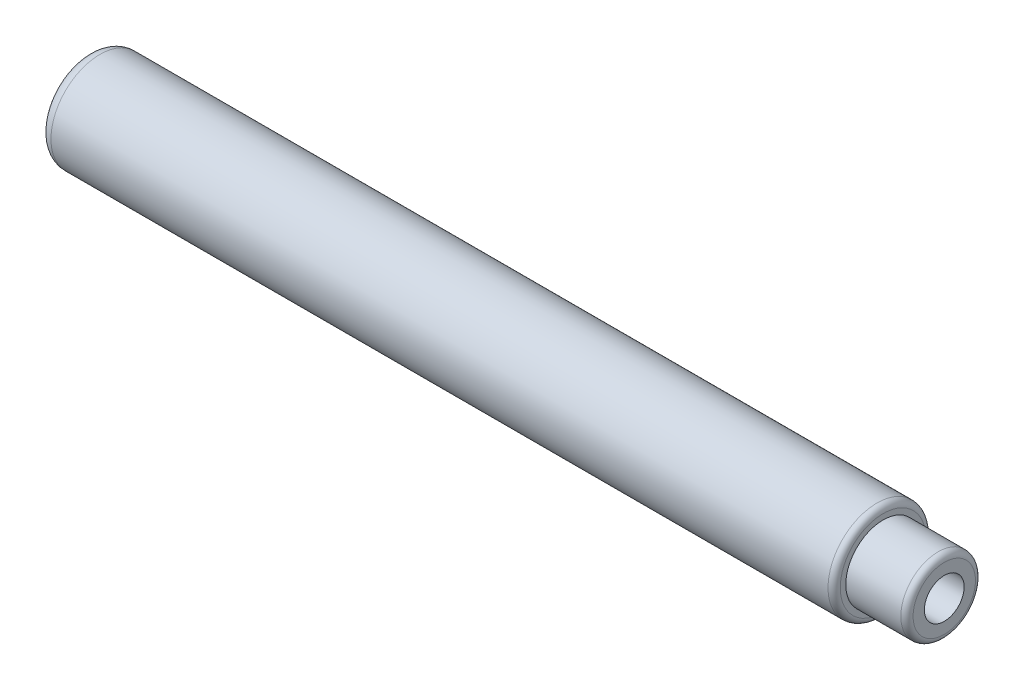
ISO-10303-21;
HEADER;
FILE_DESCRIPTION(('STEP AP214'),'2;1');
FILE_NAME('part.step','',(''),(''),'','','');
FILE_SCHEMA(('AUTOMOTIVE_DESIGN { 1 0 10303 214 1 1 1 1 }'));
ENDSEC;
DATA;
#1=APPLICATION_CONTEXT('core data for automotive mechanical design processes');
#2=APPLICATION_PROTOCOL_DEFINITION('international standard','automotive_design',2000,#1);
#3=PRODUCT_CONTEXT('',#1,'mechanical');
#4=PRODUCT('Part','Part','',(#3));
#5=PRODUCT_RELATED_PRODUCT_CATEGORY('part','',(#4));
#6=PRODUCT_DEFINITION_FORMATION('','',#4);
#7=PRODUCT_DEFINITION_CONTEXT('part definition',#1,'design');
#8=PRODUCT_DEFINITION('design','',#6,#7);
#9=PRODUCT_DEFINITION_SHAPE('','',#8);
#10=(LENGTH_UNIT() NAMED_UNIT(*) SI_UNIT(.MILLI.,.METRE.));
#11=(NAMED_UNIT(*) PLANE_ANGLE_UNIT() SI_UNIT($,.RADIAN.));
#12=(NAMED_UNIT(*) SI_UNIT($,.STERADIAN.) SOLID_ANGLE_UNIT());
#13=UNCERTAINTY_MEASURE_WITH_UNIT(LENGTH_MEASURE(1.E-05),#10,'distance_accuracy_value','');
#14=(GEOMETRIC_REPRESENTATION_CONTEXT(3) GLOBAL_UNCERTAINTY_ASSIGNED_CONTEXT((#13)) GLOBAL_UNIT_ASSIGNED_CONTEXT((#10,
#11,#12)) REPRESENTATION_CONTEXT('',''));
#15=CARTESIAN_POINT('',(0.,0.,0.));
#16=DIRECTION('',(0.,0.,1.));
#17=DIRECTION('',(1.,0.,0.));
#18=AXIS2_PLACEMENT_3D('',#15,#16,#17);
#19=CARTESIAN_POINT('',(0.,0.,0.));
#20=DIRECTION('',(-1.,0.,0.));
#21=DIRECTION('',(0.,0.,1.));
#22=AXIS2_PLACEMENT_3D('',#19,#20,#21);
#23=CYLINDRICAL_SURFACE('',#22,8.);
#24=CARTESIAN_POINT('',(129.,0.,0.));
#25=DIRECTION('',(1.,0.,0.));
#26=DIRECTION('',(0.,0.,-1.));
#27=AXIS2_PLACEMENT_3D('',#24,#25,#26);
#28=CIRCLE('',#27,8.);
#29=CARTESIAN_POINT('',(129.,0.,-8.));
#30=VERTEX_POINT('',#29);
#31=EDGE_CURVE('E47',#30,#30,#28,.F.);
#32=ORIENTED_EDGE('',*,*,#31,.T.);
#33=EDGE_LOOP('',(#32));
#34=FACE_BOUND('',#33,.T.);
#35=CARTESIAN_POINT('',(2.,0.,0.));
#36=DIRECTION('',(1.,0.,0.));
#37=DIRECTION('',(0.,0.,-1.));
#38=AXIS2_PLACEMENT_3D('',#35,#36,#37);
#39=CIRCLE('',#38,8.);
#40=CARTESIAN_POINT('',(2.,0.,-8.));
#41=VERTEX_POINT('',#40);
#42=EDGE_CURVE('E56',#41,#41,#39,.T.);
#43=ORIENTED_EDGE('',*,*,#42,.T.);
#44=EDGE_LOOP('',(#43));
#45=FACE_BOUND('',#44,.T.);
#46=ADVANCED_FACE('F36',(#34,#45),#23,.T.);
#47=CARTESIAN_POINT('',(0.,0.,0.));
#48=DIRECTION('',(1.,0.,0.));
#49=DIRECTION('',(0.,0.,-1.));
#50=AXIS2_PLACEMENT_3D('',#47,#48,#49);
#51=PLANE('',#50);
#52=CARTESIAN_POINT('',(0.,0.,0.));
#53=DIRECTION('',(1.,0.,0.));
#54=DIRECTION('',(0.,0.,-1.));
#55=AXIS2_PLACEMENT_3D('',#52,#53,#54);
#56=CIRCLE('',#55,6.);
#57=CARTESIAN_POINT('',(0.,0.,-6.));
#58=VERTEX_POINT('',#57);
#59=EDGE_CURVE('E59',#58,#58,#56,.F.);
#60=ORIENTED_EDGE('',*,*,#59,.T.);
#61=EDGE_LOOP('',(#60));
#62=FACE_BOUND('',#61,.T.);
#63=ADVANCED_FACE('F92',(#62),#51,.F.);
#64=CARTESIAN_POINT('',(130.,0.,0.));
#65=DIRECTION('',(1.,0.,0.));
#66=DIRECTION('',(0.,0.,-1.));
#67=AXIS2_PLACEMENT_3D('',#64,#65,#66);
#68=PLANE('',#67);
#69=CARTESIAN_POINT('',(130.,0.,0.));
#70=DIRECTION('',(1.,0.,0.));
#71=DIRECTION('',(0.,0.,-1.));
#72=AXIS2_PLACEMENT_3D('',#69,#70,#71);
#73=CIRCLE('',#72,7.);
#74=CARTESIAN_POINT('',(130.,0.,-7.));
#75=VERTEX_POINT('',#74);
#76=EDGE_CURVE('E51',#75,#75,#73,.T.);
#77=ORIENTED_EDGE('',*,*,#76,.T.);
#78=EDGE_LOOP('',(#77));
#79=FACE_BOUND('',#78,.T.);
#80=CARTESIAN_POINT('',(130.,0.,0.));
#81=DIRECTION('',(1.,0.,0.));
#82=DIRECTION('',(0.,0.,-1.));
#83=AXIS2_PLACEMENT_3D('',#80,#81,#82);
#84=CIRCLE('',#83,6.1);
#85=CARTESIAN_POINT('',(130.,0.,-6.1));
#86=VERTEX_POINT('',#85);
#87=EDGE_CURVE('E62',#86,#86,#84,.T.);
#88=ORIENTED_EDGE('',*,*,#87,.F.);
#89=EDGE_LOOP('',(#88));
#90=FACE_BOUND('',#89,.T.);
#91=ADVANCED_FACE('F87',(#79,#90),#68,.T.);
#92=CARTESIAN_POINT('',(130.,0.,0.));
#93=DIRECTION('',(1.,0.,0.));
#94=DIRECTION('',(0.,0.,-1.));
#95=AXIS2_PLACEMENT_3D('',#92,#93,#94);
#96=CYLINDRICAL_SURFACE('',#95,6.1);
#97=CARTESIAN_POINT('',(139.,0.,0.));
#98=DIRECTION('',(-1.,0.,0.));
#99=DIRECTION('',(0.,0.,1.));
#100=AXIS2_PLACEMENT_3D('',#97,#98,#99);
#101=CIRCLE('',#100,6.1);
#102=CARTESIAN_POINT('',(139.,0.,6.1));
#103=VERTEX_POINT('',#102);
#104=EDGE_CURVE('E10',#103,#103,#101,.T.);
#105=ORIENTED_EDGE('',*,*,#104,.T.);
#106=EDGE_LOOP('',(#105));
#107=FACE_BOUND('',#106,.T.);
#108=ORIENTED_EDGE('',*,*,#87,.T.);
#109=EDGE_LOOP('',(#108));
#110=FACE_BOUND('',#109,.T.);
#111=ADVANCED_FACE('F82',(#107,#110),#96,.T.);
#112=CARTESIAN_POINT('',(140.,0.,0.));
#113=DIRECTION('',(-1.,0.,0.));
#114=DIRECTION('',(0.,0.,1.));
#115=AXIS2_PLACEMENT_3D('',#112,#113,#114);
#116=PLANE('',#115);
#117=CARTESIAN_POINT('',(140.,0.,0.));
#118=DIRECTION('',(-1.,0.,0.));
#119=DIRECTION('',(0.,0.,1.));
#120=AXIS2_PLACEMENT_3D('',#117,#118,#119);
#121=CIRCLE('',#120,5.1);
#122=CARTESIAN_POINT('',(140.,0.,5.1));
#123=VERTEX_POINT('',#122);
#124=EDGE_CURVE('E43',#123,#123,#121,.F.);
#125=ORIENTED_EDGE('',*,*,#124,.T.);
#126=EDGE_LOOP('',(#125));
#127=FACE_BOUND('',#126,.T.);
#128=CARTESIAN_POINT('',(140.,0.,0.));
#129=DIRECTION('',(1.,0.,0.));
#130=DIRECTION('',(0.,0.,-1.));
#131=AXIS2_PLACEMENT_3D('',#128,#129,#130);
#132=CIRCLE('',#131,3.25);
#133=CARTESIAN_POINT('',(140.,0.,-3.25));
#134=VERTEX_POINT('',#133);
#135=EDGE_CURVE('E66',#134,#134,#132,.T.);
#136=ORIENTED_EDGE('',*,*,#135,.F.);
#137=EDGE_LOOP('',(#136));
#138=FACE_BOUND('',#137,.T.);
#139=ADVANCED_FACE('F77',(#127,#138),#116,.F.);
#140=CARTESIAN_POINT('',(130.,0.,0.));
#141=DIRECTION('',(1.,0.,0.));
#142=DIRECTION('',(0.,0.,-1.));
#143=AXIS2_PLACEMENT_3D('',#140,#141,#142);
#144=CYLINDRICAL_SURFACE('',#143,3.25);
#145=CARTESIAN_POINT('',(130.,0.,0.));
#146=DIRECTION('',(1.,0.,0.));
#147=DIRECTION('',(0.,0.,-1.));
#148=AXIS2_PLACEMENT_3D('',#145,#146,#147);
#149=CIRCLE('',#148,3.25);
#150=CARTESIAN_POINT('',(130.,0.,-3.25));
#151=VERTEX_POINT('',#150);
#152=EDGE_CURVE('E65',#151,#151,#149,.T.);
#153=ORIENTED_EDGE('',*,*,#152,.F.);
#154=EDGE_LOOP('',(#153));
#155=FACE_BOUND('',#154,.T.);
#156=ORIENTED_EDGE('',*,*,#135,.T.);
#157=EDGE_LOOP('',(#156));
#158=FACE_BOUND('',#157,.T.);
#159=ADVANCED_FACE('F74',(#155,#158),#144,.F.);
#160=CARTESIAN_POINT('',(130.,0.,0.));
#161=DIRECTION('',(1.,0.,0.));
#162=DIRECTION('',(0.,0.,-1.));
#163=AXIS2_PLACEMENT_3D('',#160,#161,#162);
#164=PLANE('',#163);
#165=ORIENTED_EDGE('',*,*,#152,.T.);
#166=EDGE_LOOP('',(#165));
#167=FACE_BOUND('',#166,.T.);
#168=ADVANCED_FACE('F72',(#167),#164,.T.);
#169=CARTESIAN_POINT('',(2.,0.,0.));
#170=DIRECTION('',(1.,0.,0.));
#171=DIRECTION('',(0.,0.,-1.));
#172=AXIS2_PLACEMENT_3D('',#169,#170,#171);
#173=TOROIDAL_SURFACE('',#172,6.,2.);
#174=ORIENTED_EDGE('',*,*,#42,.F.);
#175=EDGE_LOOP('',(#174));
#176=FACE_BOUND('',#175,.T.);
#177=ORIENTED_EDGE('',*,*,#59,.F.);
#178=EDGE_LOOP('',(#177));
#179=FACE_BOUND('',#178,.T.);
#180=ADVANCED_FACE('F101',(#176,#179),#173,.T.);
#181=CARTESIAN_POINT('',(129.,0.,0.));
#182=DIRECTION('',(1.,0.,0.));
#183=DIRECTION('',(0.,0.,-1.));
#184=AXIS2_PLACEMENT_3D('',#181,#182,#183);
#185=TOROIDAL_SURFACE('',#184,7.,1.);
#186=ORIENTED_EDGE('',*,*,#31,.F.);
#187=EDGE_LOOP('',(#186));
#188=FACE_BOUND('',#187,.T.);
#189=ORIENTED_EDGE('',*,*,#76,.F.);
#190=EDGE_LOOP('',(#189));
#191=FACE_BOUND('',#190,.T.);
#192=ADVANCED_FACE('F103',(#188,#191),#185,.T.);
#193=CARTESIAN_POINT('',(139.,0.,0.));
#194=DIRECTION('',(-1.,0.,0.));
#195=DIRECTION('',(0.,0.,1.));
#196=AXIS2_PLACEMENT_3D('',#193,#194,#195);
#197=TOROIDAL_SURFACE('',#196,5.1,1.);
#198=ORIENTED_EDGE('',*,*,#104,.F.);
#199=EDGE_LOOP('',(#198));
#200=FACE_BOUND('',#199,.T.);
#201=ORIENTED_EDGE('',*,*,#124,.F.);
#202=EDGE_LOOP('',(#201));
#203=FACE_BOUND('',#202,.T.);
#204=ADVANCED_FACE('F38',(#200,#203),#197,.T.);
#205=CLOSED_SHELL('',(#46,#63,#91,#111,#139,#159,#168,#180,#192,#204));
#206=MANIFOLD_SOLID_BREP('B2',#205);
#207=ADVANCED_BREP_SHAPE_REPRESENTATION('',(#18,#206),#14);
#208=SHAPE_DEFINITION_REPRESENTATION(#9,#207);
ENDSEC;
END-ISO-10303-21;
